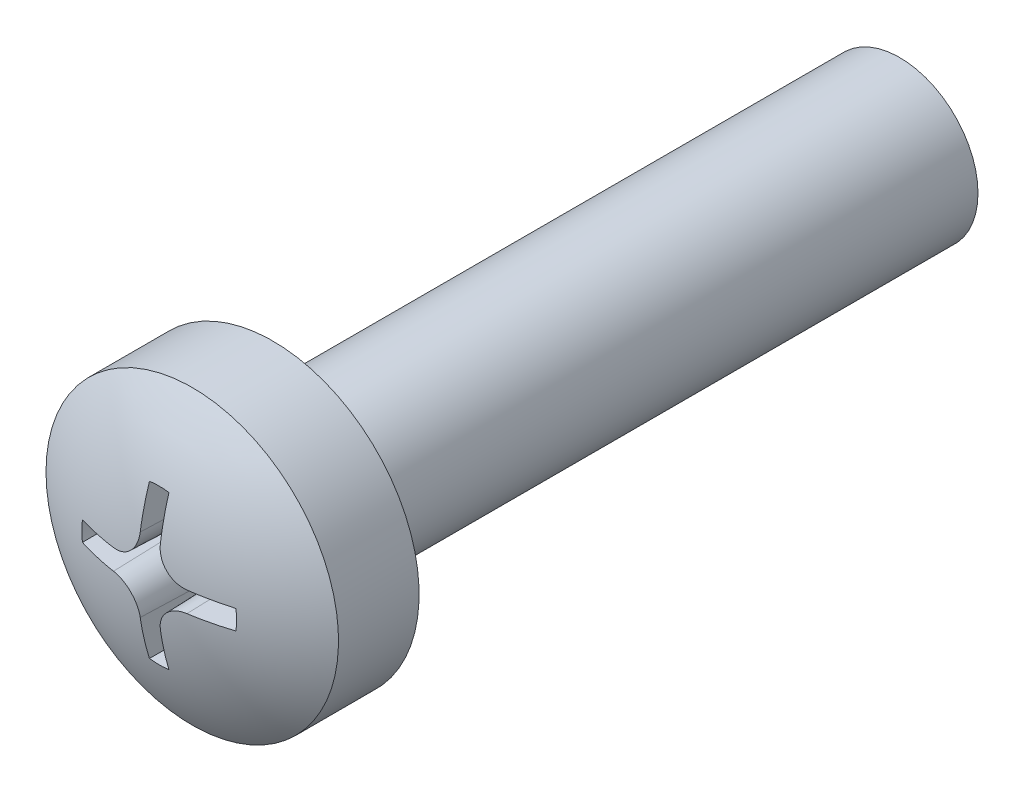
ISO-10303-21;
HEADER;
FILE_DESCRIPTION(('STEP AP214'),'2;1');
FILE_NAME('part.step','',(''),(''),'','','');
FILE_SCHEMA(('AUTOMOTIVE_DESIGN { 1 0 10303 214 1 1 1 1 }'));
ENDSEC;
DATA;
#1=APPLICATION_CONTEXT('core data for automotive mechanical design processes');
#2=APPLICATION_PROTOCOL_DEFINITION('international standard','automotive_design',2000,#1);
#3=PRODUCT_CONTEXT('',#1,'mechanical');
#4=PRODUCT('Part','Part','',(#3));
#5=PRODUCT_RELATED_PRODUCT_CATEGORY('part','',(#4));
#6=PRODUCT_DEFINITION_FORMATION('','',#4);
#7=PRODUCT_DEFINITION_CONTEXT('part definition',#1,'design');
#8=PRODUCT_DEFINITION('design','',#6,#7);
#9=PRODUCT_DEFINITION_SHAPE('','',#8);
#10=(LENGTH_UNIT() NAMED_UNIT(*) SI_UNIT(.MILLI.,.METRE.));
#11=(NAMED_UNIT(*) PLANE_ANGLE_UNIT() SI_UNIT($,.RADIAN.));
#12=(NAMED_UNIT(*) SI_UNIT($,.STERADIAN.) SOLID_ANGLE_UNIT());
#13=UNCERTAINTY_MEASURE_WITH_UNIT(LENGTH_MEASURE(1.E-05),#10,'distance_accuracy_value','');
#14=(GEOMETRIC_REPRESENTATION_CONTEXT(3) GLOBAL_UNCERTAINTY_ASSIGNED_CONTEXT((#13)) GLOBAL_UNIT_ASSIGNED_CONTEXT((#10,
#11,#12)) REPRESENTATION_CONTEXT('',''));
#15=CARTESIAN_POINT('',(0.,0.,0.));
#16=DIRECTION('',(0.,0.,1.));
#17=DIRECTION('',(1.,0.,0.));
#18=AXIS2_PLACEMENT_3D('',#15,#16,#17);
#19=CARTESIAN_POINT('',(0.,0.,12.));
#20=DIRECTION('',(0.,0.,-1.));
#21=DIRECTION('',(-1.,0.,0.));
#22=AXIS2_PLACEMENT_3D('',#19,#20,#21);
#23=CYLINDRICAL_SURFACE('',#22,1.5);
#24=CARTESIAN_POINT('',(0.,0.,12.));
#25=DIRECTION('',(0.,0.,1.));
#26=DIRECTION('',(1.,0.,0.));
#27=AXIS2_PLACEMENT_3D('',#24,#25,#26);
#28=CIRCLE('',#27,1.5);
#29=CARTESIAN_POINT('',(1.5,0.,12.));
#30=VERTEX_POINT('',#29);
#31=EDGE_CURVE('E213',#30,#30,#28,.T.);
#32=ORIENTED_EDGE('',*,*,#31,.F.);
#33=EDGE_LOOP('',(#32));
#34=FACE_BOUND('',#33,.T.);
#35=CARTESIAN_POINT('',(0.,0.,-0.0001));
#36=DIRECTION('',(0.,0.,1.));
#37=DIRECTION('',(1.,0.,0.));
#38=AXIS2_PLACEMENT_3D('',#35,#36,#37);
#39=CIRCLE('',#38,1.5);
#40=CARTESIAN_POINT('',(1.5,0.,-0.0001));
#41=VERTEX_POINT('',#40);
#42=EDGE_CURVE('E210',#41,#41,#39,.T.);
#43=ORIENTED_EDGE('',*,*,#42,.T.);
#44=EDGE_LOOP('',(#43));
#45=FACE_BOUND('',#44,.T.);
#46=ADVANCED_FACE('F39',(#34,#45),#23,.T.);
#47=CARTESIAN_POINT('',(0.,0.,-0.0001));
#48=DIRECTION('',(0.,0.,1.));
#49=DIRECTION('',(1.,0.,0.));
#50=AXIS2_PLACEMENT_3D('',#47,#48,#49);
#51=PLANE('',#50);
#52=ORIENTED_EDGE('',*,*,#42,.F.);
#53=EDGE_LOOP('',(#52));
#54=FACE_BOUND('',#53,.T.);
#55=ADVANCED_FACE('F300',(#54),#51,.F.);
#56=CARTESIAN_POINT('',(0.,0.,12.));
#57=DIRECTION('',(0.,0.,-1.));
#58=DIRECTION('',(-1.,0.,0.));
#59=AXIS2_PLACEMENT_3D('',#56,#57,#58);
#60=PLANE('',#59);
#61=ORIENTED_EDGE('',*,*,#31,.T.);
#62=EDGE_LOOP('',(#61));
#63=FACE_BOUND('',#62,.T.);
#64=CARTESIAN_POINT('',(0.,0.,12.));
#65=DIRECTION('',(0.,0.,-1.));
#66=DIRECTION('',(-1.,0.,0.));
#67=AXIS2_PLACEMENT_3D('',#64,#65,#66);
#68=CIRCLE('',#67,2.79999990016222);
#69=CARTESIAN_POINT('',(-2.79999990016222,0.,12.));
#70=VERTEX_POINT('',#69);
#71=EDGE_CURVE('E207',#70,#70,#68,.T.);
#72=ORIENTED_EDGE('',*,*,#71,.T.);
#73=EDGE_LOOP('',(#72));
#74=FACE_BOUND('',#73,.T.);
#75=ADVANCED_FACE('F305',(#63,#74),#60,.T.);
#76=CARTESIAN_POINT('',(0.,0.,-0.393620134621003));
#77=DIRECTION('',(0.,0.,-1.));
#78=DIRECTION('',(-1.,0.,0.));
#79=AXIS2_PLACEMENT_3D('',#76,#77,#78);
#80=CYLINDRICAL_SURFACE('',#79,2.79999990016222);
#81=CARTESIAN_POINT('',(0.,0.,13.5424630797893));
#82=DIRECTION('',(0.,0.,-1.));
#83=DIRECTION('',(-1.,0.,0.));
#84=AXIS2_PLACEMENT_3D('',#81,#82,#83);
#85=CIRCLE('',#84,2.79999990016222);
#86=CARTESIAN_POINT('',(-2.79999990016222,0.,13.5424630797893));
#87=VERTEX_POINT('',#86);
#88=EDGE_CURVE('E155',#87,#87,#85,.T.);
#89=ORIENTED_EDGE('',*,*,#88,.T.);
#90=EDGE_LOOP('',(#89));
#91=FACE_BOUND('',#90,.T.);
#92=ORIENTED_EDGE('',*,*,#71,.F.);
#93=EDGE_LOOP('',(#92));
#94=FACE_BOUND('',#93,.T.);
#95=ADVANCED_FACE('F313',(#91,#94),#80,.T.);
#96=CARTESIAN_POINT('',(0.,0.,9.40000011175871));
#97=DIRECTION('',(0.,0.,-1.));
#98=DIRECTION('',(1.,0.,0.));
#99=AXIS2_PLACEMENT_3D('',#96,#97,#98);
#100=SPHERICAL_SURFACE('',#99,4.99999988824129);
#101=CARTESIAN_POINT('',(0.,0.,14.1754183821502));
#102=DIRECTION('',(0.,0.,-1.));
#103=DIRECTION('',(-1.,0.,0.));
#104=AXIS2_PLACEMENT_3D('',#101,#102,#103);
#105=CIRCLE('',#104,1.4816812157899);
#106=CARTESIAN_POINT('',(0.18668120666759,1.46987392394782,14.1754183821501));
#107=VERTEX_POINT('',#106);
#108=CARTESIAN_POINT('',(-0.186681206667593,1.46987392394782,14.1754183821501));
#109=VERTEX_POINT('',#108);
#110=EDGE_CURVE('E11',#107,#109,#105,.F.);
#111=ORIENTED_EDGE('',*,*,#110,.F.);
#112=CARTESIAN_POINT('',(0.0198956640512633,0.,9.39930533986049));
#113=DIRECTION('',(0.999390827019096,0.,-0.034899496702501));
#114=DIRECTION('',(-0.034899496702501,0.,-0.999390827019096));
#115=AXIS2_PLACEMENT_3D('',#112,#113,#114);
#116=CIRCLE('',#115,4.99996025606773);
#117=CARTESIAN_POINT('',(0.192632610704328,0.708178557647151,14.3458442955351));
#118=VERTEX_POINT('',#117);
#119=EDGE_CURVE('E46',#107,#118,#116,.T.);
#120=ORIENTED_EDGE('',*,*,#119,.T.);
#121=CARTESIAN_POINT('',(0.192631650862954,0.708378557647151,14.345815691475));
#122=CARTESIAN_POINT('',(0.192737639690806,0.679822741796073,14.3499041439734));
#123=CARTESIAN_POINT('',(0.195268867839181,0.651227392830896,14.3536463362414));
#124=CARTESIAN_POINT('',(0.205046889209158,0.59476703827459,14.3603460551712));
#125=CARTESIAN_POINT('',(0.212292618678018,0.566901869404939,14.3633037586285));
#126=CARTESIAN_POINT('',(0.231373694375068,0.51267267841366,14.3683466063254));
#127=CARTESIAN_POINT('',(0.24321326807329,0.486310064716558,14.3704309431667));
#128=CARTESIAN_POINT('',(0.271156607880554,0.435900324544809,14.3736603491012));
#129=CARTESIAN_POINT('',(0.287258672100205,0.411852279143786,14.3748057923215));
#130=CARTESIAN_POINT('',(0.323072075489885,0.367028886470806,14.3761158025717));
#131=CARTESIAN_POINT('',(0.342740648168188,0.346219679514825,14.3762912893596));
#132=CARTESIAN_POINT('',(0.385246757538768,0.30814670944778,14.3756853456951));
#133=CARTESIAN_POINT('',(0.408084792807392,0.290883505206881,14.3749037645383));
#134=CARTESIAN_POINT('',(0.456147210008961,0.260464262414973,14.3724133951705));
#135=CARTESIAN_POINT('',(0.481359759209805,0.247289131136679,14.3707090224733));
#136=CARTESIAN_POINT('',(0.533541444049374,0.225283958921734,14.3664258870809));
#137=CARTESIAN_POINT('',(0.560509920861877,0.216452298826715,14.3638474508254));
#138=CARTESIAN_POINT('',(0.606876295057338,0.205379627868596,14.3588207651558));
#139=CARTESIAN_POINT('',(0.626020977094074,0.201943221890059,14.3565812960749));
#140=CARTESIAN_POINT('',(0.66450204404321,0.197253494550336,14.3517582366185));
#141=CARTESIAN_POINT('',(0.683838077649067,0.195996727127303,14.349175196413));
#142=CARTESIAN_POINT('',(0.703167546290468,0.195835015722445,14.3464334662955));
#143=B_SPLINE_CURVE_WITH_KNOTS('',3,(#121,#122,#123,#124,#125,#126,#127,#128,#129,#130,#131,
#132,#133,#134,#135,#136,#137,#138,#139,#140,#141,#142),.UNSPECIFIED.,.F.,.F.,(4,2,2,2,2,2,2,2,
2,2,4),(0.,0.0864417829586744,0.172864068455127,0.259366073122684,0.345833591994609,
0.431325646912079,0.516831165542016,0.601931114274005,0.686999315371811,0.745618262708562,
0.804144447281415),.UNSPECIFIED.);
#144=CARTESIAN_POINT('',(0.702917362553185,0.19583721033533,14.3464689381926));
#145=VERTEX_POINT('',#144);
#146=EDGE_CURVE('E282',#118,#145,#143,.T.);
#147=ORIENTED_EDGE('',*,*,#146,.T.);
#148=CARTESIAN_POINT('',(0.000105390153350327,0.0259265633149154,9.39909472873738));
#149=DIRECTION('',(0.00406243901494415,0.999382570249833,-0.034899496702501));
#150=DIRECTION('',(0.,0.0348997846864301,0.999390816962434));
#151=AXIS2_PLACEMENT_3D('',#148,#149,#150);
#152=CIRCLE('',#151,4.99993258603575);
#153=CARTESIAN_POINT('',(1.46986565043204,0.186746338396853,14.1754183821502));
#154=VERTEX_POINT('',#153);
#155=EDGE_CURVE('E280',#154,#145,#152,.F.);
#156=ORIENTED_EDGE('',*,*,#155,.F.);
#157=CARTESIAN_POINT('',(0.,0.,14.1754183821502));
#158=DIRECTION('',(0.,0.,-1.));
#159=DIRECTION('',(-1.,0.,0.));
#160=AXIS2_PLACEMENT_3D('',#157,#158,#159);
#161=CIRCLE('',#160,1.4816812157899);
#162=CARTESIAN_POINT('',(1.46986565043204,-0.186746338396852,14.1754183821501));
#163=VERTEX_POINT('',#162);
#164=EDGE_CURVE('E278',#163,#154,#161,.F.);
#165=ORIENTED_EDGE('',*,*,#164,.F.);
#166=CARTESIAN_POINT('',(0.000105390153350358,-0.0259265633149169,9.39909472873738));
#167=DIRECTION('',(0.00406243901494512,-0.999382570249833,-0.034899496702501));
#168=DIRECTION('',(0.,0.0348997846864301,-0.999390816962434));
#169=AXIS2_PLACEMENT_3D('',#166,#167,#168);
#170=CIRCLE('',#169,4.99993258603575);
#171=CARTESIAN_POINT('',(0.702917362553185,-0.195837210335331,14.3464689381926));
#172=VERTEX_POINT('',#171);
#173=EDGE_CURVE('E275',#163,#172,#170,.T.);
#174=ORIENTED_EDGE('',*,*,#173,.T.);
#175=CARTESIAN_POINT('',(0.192631650862954,-0.708378557647152,14.345815691475));
#176=CARTESIAN_POINT('',(0.192737639690806,-0.679822741796074,14.3499041439734));
#177=CARTESIAN_POINT('',(0.195268867839181,-0.651227392830896,14.3536463362414));
#178=CARTESIAN_POINT('',(0.205046889209158,-0.59476703827459,14.3603460551712));
#179=CARTESIAN_POINT('',(0.212292618678018,-0.56690186940494,14.3633037586285));
#180=CARTESIAN_POINT('',(0.231373694375068,-0.512672678413661,14.3683466063254));
#181=CARTESIAN_POINT('',(0.24321326807329,-0.486310064716559,14.3704309431667));
#182=CARTESIAN_POINT('',(0.271156607880554,-0.435900324544809,14.3736603491012));
#183=CARTESIAN_POINT('',(0.287258672100205,-0.411852279143786,14.3748057923215));
#184=CARTESIAN_POINT('',(0.323072075489885,-0.367028886470807,14.3761158025717));
#185=CARTESIAN_POINT('',(0.342740648168188,-0.346219679514826,14.3762912893596));
#186=CARTESIAN_POINT('',(0.385246757538768,-0.308146709447781,14.3756853456951));
#187=CARTESIAN_POINT('',(0.408084792807392,-0.290883505206882,14.3749037645383));
#188=CARTESIAN_POINT('',(0.456147210008961,-0.260464262414974,14.3724133951705));
#189=CARTESIAN_POINT('',(0.481359759209805,-0.247289131136679,14.3707090224733));
#190=CARTESIAN_POINT('',(0.533541444049374,-0.225283958921735,14.3664258870809));
#191=CARTESIAN_POINT('',(0.560509920861878,-0.216452298826716,14.3638474508254));
#192=CARTESIAN_POINT('',(0.606876295057338,-0.205379627868597,14.3588207651558));
#193=CARTESIAN_POINT('',(0.626020977094074,-0.201943221890059,14.3565812960749));
#194=CARTESIAN_POINT('',(0.66450204404321,-0.197253494550336,14.3517582366185));
#195=CARTESIAN_POINT('',(0.683838077649067,-0.195996727127304,14.349175196413));
#196=CARTESIAN_POINT('',(0.703167546290467,-0.195835015722445,14.3464334662955));
#197=B_SPLINE_CURVE_WITH_KNOTS('',3,(#175,#176,#177,#178,#179,#180,#181,#182,#183,#184,#185,
#186,#187,#188,#189,#190,#191,#192,#193,#194,#195,#196),.UNSPECIFIED.,.F.,.F.,(4,2,2,2,2,2,2,2,
2,2,4),(0.,0.0864417829586746,0.172864068455127,0.259366073122684,0.345833591994609,
0.431325646912079,0.516831165542017,0.601931114274005,0.686999315371811,0.745618262708562,
0.804144447281414),.UNSPECIFIED.);
#198=CARTESIAN_POINT('',(0.192632610704328,-0.708178557647152,14.3458442955351));
#199=VERTEX_POINT('',#198);
#200=EDGE_CURVE('E269',#199,#172,#197,.T.);
#201=ORIENTED_EDGE('',*,*,#200,.F.);
#202=CARTESIAN_POINT('',(0.0198956640512633,0.,9.39930533986049));
#203=DIRECTION('',(0.999390827019096,0.,-0.034899496702501));
#204=DIRECTION('',(-0.034899496702501,0.,-0.999390827019096));
#205=AXIS2_PLACEMENT_3D('',#202,#203,#204);
#206=CIRCLE('',#205,4.99996025606773);
#207=CARTESIAN_POINT('',(0.186681206667591,-1.46987392394782,14.1754183821502));
#208=VERTEX_POINT('',#207);
#209=EDGE_CURVE('E267',#208,#199,#206,.F.);
#210=ORIENTED_EDGE('',*,*,#209,.F.);
#211=CARTESIAN_POINT('',(0.,0.,14.1754183821502));
#212=DIRECTION('',(0.,0.,-1.));
#213=DIRECTION('',(-1.,0.,0.));
#214=AXIS2_PLACEMENT_3D('',#211,#212,#213);
#215=CIRCLE('',#214,1.4816812157899);
#216=CARTESIAN_POINT('',(-0.186681206667593,-1.46987392394782,14.1754183821501));
#217=VERTEX_POINT('',#216);
#218=EDGE_CURVE('E264',#208,#217,#215,.T.);
#219=ORIENTED_EDGE('',*,*,#218,.T.);
#220=CARTESIAN_POINT('',(-0.0198956640512654,0.,9.39930533986049));
#221=DIRECTION('',(-0.999390827019096,0.,-0.034899496702501));
#222=DIRECTION('',(-0.034899496702501,0.,0.999390827019096));
#223=AXIS2_PLACEMENT_3D('',#220,#221,#222);
#224=CIRCLE('',#223,4.99996025606773);
#225=CARTESIAN_POINT('',(-0.19263261070433,-0.708178557647151,14.3458442955351));
#226=VERTEX_POINT('',#225);
#227=EDGE_CURVE('E260',#217,#226,#224,.T.);
#228=ORIENTED_EDGE('',*,*,#227,.T.);
#229=CARTESIAN_POINT('',(-0.703167546290469,-0.195835015722445,14.3464334662955));
#230=CARTESIAN_POINT('',(-0.674619447950853,-0.196052963217916,14.3504857241648));
#231=CARTESIAN_POINT('',(-0.646041434637229,-0.198695168407334,14.3541890416191));
#232=CARTESIAN_POINT('',(-0.589634494727846,-0.208689654905481,14.3608068014756));
#233=CARTESIAN_POINT('',(-0.561805393198952,-0.216040826152063,14.3637214295682));
#234=CARTESIAN_POINT('',(-0.50766612082123,-0.235323893103952,14.3686750861046));
#235=CARTESIAN_POINT('',(-0.481357369172764,-0.247259991703852,14.370713307523));
#236=CARTESIAN_POINT('',(-0.431071022991568,-0.275383990623327,14.3738489099634));
#237=CARTESIAN_POINT('',(-0.407092510169895,-0.291570206692359,14.3749466629444));
#238=CARTESIAN_POINT('',(-0.362416703115866,-0.327538701485095,14.3761618083202));
#239=CARTESIAN_POINT('',(-0.34168588735275,-0.34727899131776,14.376289966384));
#240=CARTESIAN_POINT('',(-0.303780328011577,-0.389912448398922,14.375590364716));
#241=CARTESIAN_POINT('',(-0.286606147147996,-0.412806113607388,14.3747624538554));
#242=CARTESIAN_POINT('',(-0.25636685808405,-0.46096947591693,14.3721816258056));
#243=CARTESIAN_POINT('',(-0.243283863198686,-0.486228184526672,14.3704328274806));
#244=CARTESIAN_POINT('',(-0.22146899790456,-0.538485231439468,14.366063898297));
#245=CARTESIAN_POINT('',(-0.212735526227358,-0.565482925398505,14.3634440886927));
#246=CARTESIAN_POINT('',(-0.201823996880683,-0.61191361527353,14.3583478129874));
#247=CARTESIAN_POINT('',(-0.198453223120025,-0.631098599357625,14.3560784464194));
#248=CARTESIAN_POINT('',(-0.193901764340931,-0.669652448873598,14.3511968730386));
#249=CARTESIAN_POINT('',(-0.192717622166764,-0.689020975292663,14.3485852144187));
#250=CARTESIAN_POINT('',(-0.192631650862956,-0.708378557647151,14.345815691475));
#251=B_SPLINE_CURVE_WITH_KNOTS('',3,(#229,#230,#231,#232,#233,#234,#235,#236,#237,#238,#239,
#240,#241,#242,#243,#244,#245,#246,#247,#248,#249,#250),.UNSPECIFIED.,.F.,.F.,(4,2,2,2,2,2,2,2,
2,2,4),(0.,0.0864053436114192,0.17279032606061,0.259254685287909,0.345684831711331,
0.431153892876567,0.51663646625136,0.601739908197797,0.686811996276178,0.745524819849982,
0.804144736260156),.UNSPECIFIED.);
#252=CARTESIAN_POINT('',(-0.702917362553187,-0.195837210335331,14.3464689381926));
#253=VERTEX_POINT('',#252);
#254=EDGE_CURVE('E253',#253,#226,#251,.T.);
#255=ORIENTED_EDGE('',*,*,#254,.F.);
#256=CARTESIAN_POINT('',(-0.000105390153349678,-0.0259265633149168,9.39909472873738));
#257=DIRECTION('',(-0.0040624390149453,-0.999382570249833,-0.034899496702501));
#258=DIRECTION('',(0.,0.0348997846864301,-0.999390816962434));
#259=AXIS2_PLACEMENT_3D('',#256,#257,#258);
#260=CIRCLE('',#259,4.99993258603575);
#261=CARTESIAN_POINT('',(-1.46986565043204,-0.186746338396853,14.1754183821502));
#262=VERTEX_POINT('',#261);
#263=EDGE_CURVE('E261',#262,#253,#260,.F.);
#264=ORIENTED_EDGE('',*,*,#263,.F.);
#265=CARTESIAN_POINT('',(0.,0.,14.1754183821502));
#266=DIRECTION('',(0.,0.,-1.));
#267=DIRECTION('',(-1.,0.,0.));
#268=AXIS2_PLACEMENT_3D('',#265,#266,#267);
#269=CIRCLE('',#268,1.4816812157899);
#270=CARTESIAN_POINT('',(-1.46986565043204,0.186746338396852,14.1754183821501));
#271=VERTEX_POINT('',#270);
#272=EDGE_CURVE('E521',#262,#271,#269,.T.);
#273=ORIENTED_EDGE('',*,*,#272,.T.);
#274=CARTESIAN_POINT('',(-0.000105390153349678,0.0259265633149168,9.39909472873738));
#275=DIRECTION('',(-0.00406243901494529,0.999382570249833,-0.034899496702501));
#276=DIRECTION('',(0.,0.0348997846864301,0.999390816962434));
#277=AXIS2_PLACEMENT_3D('',#274,#275,#276);
#278=CIRCLE('',#277,4.99993258603575);
#279=CARTESIAN_POINT('',(-0.702917362553187,0.195837210335331,14.3464689381926));
#280=VERTEX_POINT('',#279);
#281=EDGE_CURVE('E226',#271,#280,#278,.T.);
#282=ORIENTED_EDGE('',*,*,#281,.T.);
#283=CARTESIAN_POINT('',(-0.192631650862955,0.708378557647151,14.345815691475));
#284=CARTESIAN_POINT('',(-0.192737639690808,0.679822741796074,14.3499041439734));
#285=CARTESIAN_POINT('',(-0.195268867839183,0.651227392830896,14.3536463362414));
#286=CARTESIAN_POINT('',(-0.20504688920916,0.59476703827459,14.3603460551712));
#287=CARTESIAN_POINT('',(-0.21229261867802,0.566901869404939,14.3633037586285));
#288=CARTESIAN_POINT('',(-0.231373694375069,0.51267267841366,14.3683466063254));
#289=CARTESIAN_POINT('',(-0.243213268073292,0.486310064716559,14.3704309431667));
#290=CARTESIAN_POINT('',(-0.271156607880555,0.435900324544809,14.3736603491012));
#291=CARTESIAN_POINT('',(-0.287258672100206,0.411852279143786,14.3748057923215));
#292=CARTESIAN_POINT('',(-0.323072075489887,0.367028886470806,14.3761158025717));
#293=CARTESIAN_POINT('',(-0.34274064816819,0.346219679514826,14.3762912893596));
#294=CARTESIAN_POINT('',(-0.38524675753877,0.30814670944778,14.3756853456951));
#295=CARTESIAN_POINT('',(-0.408084792807394,0.290883505206882,14.3749037645383));
#296=CARTESIAN_POINT('',(-0.456147210008963,0.260464262414974,14.3724133951705));
#297=CARTESIAN_POINT('',(-0.481359759209807,0.247289131136679,14.3707090224733));
#298=CARTESIAN_POINT('',(-0.533541444049376,0.225283958921735,14.3664258870809));
#299=CARTESIAN_POINT('',(-0.560509920861879,0.216452298826716,14.3638474508254));
#300=CARTESIAN_POINT('',(-0.60687629505734,0.205379627868597,14.3588207651558));
#301=CARTESIAN_POINT('',(-0.626020977094076,0.201943221890059,14.3565812960749));
#302=CARTESIAN_POINT('',(-0.664502044043212,0.197253494550336,14.3517582366185));
#303=CARTESIAN_POINT('',(-0.683838077649068,0.195996727127304,14.349175196413));
#304=CARTESIAN_POINT('',(-0.703167546290469,0.195835015722445,14.3464334662955));
#305=B_SPLINE_CURVE_WITH_KNOTS('',3,(#283,#284,#285,#286,#287,#288,#289,#290,#291,#292,#293,
#294,#295,#296,#297,#298,#299,#300,#301,#302,#303,#304),.UNSPECIFIED.,.F.,.F.,(4,2,2,2,2,2,2,2,
2,2,4),(0.,0.0864417829586746,0.172864068455127,0.259366073122684,0.345833591994609,
0.431325646912079,0.516831165542016,0.601931114274004,0.68699931537181,0.745618262708561,
0.804144447281414),.UNSPECIFIED.);
#306=CARTESIAN_POINT('',(-0.19263261070433,0.708178557647151,14.3458442955351));
#307=VERTEX_POINT('',#306);
#308=EDGE_CURVE('E218',#307,#280,#305,.T.);
#309=ORIENTED_EDGE('',*,*,#308,.F.);
#310=CARTESIAN_POINT('',(-0.0198956640512644,0.,9.39930533986049));
#311=DIRECTION('',(-0.999390827019096,0.,-0.034899496702501));
#312=DIRECTION('',(-0.034899496702501,0.,0.999390827019096));
#313=AXIS2_PLACEMENT_3D('',#310,#311,#312);
#314=CIRCLE('',#313,4.99996025606773);
#315=EDGE_CURVE('E216',#109,#307,#314,.F.);
#316=ORIENTED_EDGE('',*,*,#315,.F.);
#317=EDGE_LOOP('',(#111,#120,#147,#156,#165,#174,#201,#210,#219,#228,#255,#264,#273,#282,#309,#316));
#318=FACE_BOUND('',#317,.T.);
#319=ORIENTED_EDGE('',*,*,#88,.F.);
#320=EDGE_LOOP('',(#319));
#321=FACE_BOUND('',#320,.T.);
#322=ADVANCED_FACE('F228',(#318,#321),#100,.T.);
#323=CARTESIAN_POINT('',(0.,0.,14.7000001));
#324=DIRECTION('',(0.,0.,1.));
#325=DIRECTION('',(1.,0.,0.));
#326=AXIS2_PLACEMENT_3D('',#323,#324,#325);
#327=CONICAL_SURFACE('',#326,1.50000001303852,0.0349065850398867);
#328=ORIENTED_EDGE('',*,*,#110,.T.);
#329=CARTESIAN_POINT('',(-0.142142619910814,1.43009594495933,12.9000001309199));
#330=CARTESIAN_POINT('',(-0.152618658076336,1.43957885994155,13.1999946132293));
#331=CARTESIAN_POINT('',(-0.163094792502732,1.4489727928664,13.4999918520894));
#332=CARTESIAN_POINT('',(-0.184047253837866,1.46758269456637,14.0999918417828));
#333=CARTESIAN_POINT('',(-0.194523580746602,1.47679866334215,14.399994592616));
#334=CARTESIAN_POINT('',(-0.205000003916213,1.48592565006124,14.7000001));
#335=B_SPLINE_CURVE_WITH_KNOTS('',3,(#329,#330,#331,#332,#333,#334),.UNSPECIFIED.,.F.,.F.,(4,2,
4),(0.,0.900981158642231,1.80196231389533),.UNSPECIFIED.);
#336=CARTESIAN_POINT('',(-0.142142619910814,1.43009594495933,12.9000001309199));
#337=VERTEX_POINT('',#336);
#338=EDGE_CURVE('E53',#337,#109,#335,.T.);
#339=ORIENTED_EDGE('',*,*,#338,.F.);
#340=CARTESIAN_POINT('',(0.,0.,12.9000001309199));
#341=DIRECTION('',(0.,0.,1.));
#342=DIRECTION('',(1.,0.,0.));
#343=AXIS2_PLACEMENT_3D('',#340,#341,#342);
#344=CIRCLE('',#343,1.43714262903312);
#345=CARTESIAN_POINT('',(0.142142619910811,1.43009594495933,12.9000001309199));
#346=VERTEX_POINT('',#345);
#347=EDGE_CURVE('E163',#346,#337,#344,.T.);
#348=ORIENTED_EDGE('',*,*,#347,.F.);
#349=CARTESIAN_POINT('',(0.142142619910811,1.43009594495933,12.9000001309199));
#350=CARTESIAN_POINT('',(0.152618658076333,1.43957885994155,13.1999946132293));
#351=CARTESIAN_POINT('',(0.16309479250273,1.4489727928664,13.4999918520894));
#352=CARTESIAN_POINT('',(0.184047253837863,1.46758269456637,14.0999918417828));
#353=CARTESIAN_POINT('',(0.1945235807466,1.47679866334215,14.399994592616));
#354=CARTESIAN_POINT('',(0.205000003916211,1.48592565006124,14.7000001));
#355=B_SPLINE_CURVE_WITH_KNOTS('',3,(#349,#350,#351,#352,#353,#354),.UNSPECIFIED.,.F.,.F.,(4,2,
4),(0.,0.900981158642231,1.80196231389533),.UNSPECIFIED.);
#356=EDGE_CURVE('E147',#346,#107,#355,.T.);
#357=ORIENTED_EDGE('',*,*,#356,.T.);
#358=EDGE_LOOP('',(#328,#339,#348,#357));
#359=FACE_BOUND('',#358,.T.);
#360=ADVANCED_FACE('F167',(#359),#327,.F.);
#361=CARTESIAN_POINT('',(0.205000003916211,1.48592565006124,14.7000001));
#362=DIRECTION('',(0.999390827019096,0.,-0.034899496702501));
#363=DIRECTION('',(-0.034899496702501,0.,-0.999390827019096));
#364=AXIS2_PLACEMENT_3D('',#361,#362,#363);
#365=PLANE('',#364);
#366=ORIENTED_EDGE('',*,*,#356,.F.);
#367=DIRECTION('',(0.,1.,0.));
#368=VECTOR('',#367,1.);
#369=CARTESIAN_POINT('',(0.142142619910812,0.,12.9000001309199));
#370=LINE('',#369,#368);
#371=CARTESIAN_POINT('',(0.142142619910811,0.708178557647151,12.9000001309199));
#372=VERTEX_POINT('',#371);
#373=EDGE_CURVE('E150',#346,#372,#370,.F.);
#374=ORIENTED_EDGE('',*,*,#373,.T.);
#375=DIRECTION('',(0.034899496702501,0.,0.999390827019096));
#376=VECTOR('',#375,1.);
#377=CARTESIAN_POINT('',(0.20500000391621,0.708178557647151,14.7000001));
#378=LINE('',#377,#376);
#379=EDGE_CURVE('E156',#372,#118,#378,.T.);
#380=ORIENTED_EDGE('',*,*,#379,.T.);
#381=ORIENTED_EDGE('',*,*,#119,.F.);
#382=EDGE_LOOP('',(#366,#374,#380,#381));
#383=FACE_BOUND('',#382,.T.);
#384=ADVANCED_FACE('F149',(#383),#365,.F.);
#385=CARTESIAN_POINT('',(0.705000003916211,0.708178557647151,14.7000001));
#386=DIRECTION('',(0.,0.,-1.));
#387=DIRECTION('',(1.,0.,0.));
#388=AXIS2_PLACEMENT_3D('',#385,#386,#387);
#389=CONICAL_SURFACE('',#388,0.5,0.0349065850398867);
#390=ORIENTED_EDGE('',*,*,#379,.F.);
#391=CARTESIAN_POINT('',(0.705000003916211,0.708178557647151,12.9000001309199));
#392=DIRECTION('',(0.,0.,1.));
#393=DIRECTION('',(1.,0.,0.));
#394=AXIS2_PLACEMENT_3D('',#391,#392,#393);
#395=CIRCLE('',#394,0.562857384005399);
#396=CARTESIAN_POINT('',(0.702712036351556,0.145325823858085,12.9000001309199));
#397=VERTEX_POINT('',#396);
#398=EDGE_CURVE('E165',#372,#397,#395,.T.);
#399=ORIENTED_EDGE('',*,*,#398,.T.);
#400=DIRECTION('',(0.000141863496415148,0.0348992083697649,0.999390827019096));
#401=VECTOR('',#400,1.);
#402=CARTESIAN_POINT('',(0.702967546290468,0.208182688548215,14.7000001));
#403=LINE('',#402,#401);
#404=EDGE_CURVE('E423',#397,#145,#403,.T.);
#405=ORIENTED_EDGE('',*,*,#404,.T.);
#406=ORIENTED_EDGE('',*,*,#146,.F.);
#407=EDGE_LOOP('',(#390,#399,#405,#406));
#408=FACE_BOUND('',#407,.T.);
#409=ADVANCED_FACE('F288',(#408),#389,.T.);
#410=CARTESIAN_POINT('',(1.48592565006123,0.205000003916213,14.7000001));
#411=DIRECTION('',(0.00406243901494415,0.999382570249833,-0.034899496702501));
#412=DIRECTION('',(0.,0.0348997846864301,0.999390816962434));
#413=AXIS2_PLACEMENT_3D('',#410,#411,#412);
#414=PLANE('',#413);
#415=ORIENTED_EDGE('',*,*,#155,.T.);
#416=ORIENTED_EDGE('',*,*,#404,.F.);
#417=DIRECTION('',(-0.99999173819787,0.00406491525148502,0.));
#418=VECTOR('',#417,1.);
#419=CARTESIAN_POINT('',(0.000602343564913371,0.148179863836023,12.9000001309199));
#420=LINE('',#419,#418);
#421=CARTESIAN_POINT('',(1.43007341244828,0.142369137079488,12.9000001309199));
#422=VERTEX_POINT('',#421);
#423=EDGE_CURVE('E176',#422,#397,#420,.T.);
#424=ORIENTED_EDGE('',*,*,#423,.F.);
#425=CARTESIAN_POINT('',(1.43007341244828,0.142369137079488,12.9000001309199));
#426=CARTESIAN_POINT('',(1.43955869120937,0.152806706922151,13.1999946790441));
#427=CARTESIAN_POINT('',(1.44895568373278,0.163244730756208,13.4999919508073));
#428=CARTESIAN_POINT('',(1.46757309626977,0.184121686368453,14.0999919405007));
#429=CARTESIAN_POINT('',(1.47679351628402,0.194560618146638,14.3999946584309));
#430=CARTESIAN_POINT('',(1.48592565006123,0.205000003916213,14.7000001));
#431=B_SPLINE_CURVE_WITH_KNOTS('',3,(#425,#426,#427,#428,#429,#430),.UNSPECIFIED.,.F.,.F.,(4,2,
4),(0.,0.900977563471273,1.80195512360615),.UNSPECIFIED.);
#432=EDGE_CURVE('E417',#422,#154,#431,.T.);
#433=ORIENTED_EDGE('',*,*,#432,.T.);
#434=EDGE_LOOP('',(#415,#416,#424,#433));
#435=FACE_BOUND('',#434,.T.);
#436=ADVANCED_FACE('F240',(#435),#414,.F.);
#437=CARTESIAN_POINT('',(0.,0.,14.7000001));
#438=DIRECTION('',(0.,0.,1.));
#439=DIRECTION('',(1.,0.,0.));
#440=AXIS2_PLACEMENT_3D('',#437,#438,#439);
#441=CONICAL_SURFACE('',#440,1.50000001303852,0.0349065850398867);
#442=ORIENTED_EDGE('',*,*,#164,.T.);
#443=ORIENTED_EDGE('',*,*,#432,.F.);
#444=CARTESIAN_POINT('',(0.,0.,12.9000001309199));
#445=DIRECTION('',(0.,0.,1.));
#446=DIRECTION('',(1.,0.,0.));
#447=AXIS2_PLACEMENT_3D('',#444,#445,#446);
#448=CIRCLE('',#447,1.43714262903312);
#449=CARTESIAN_POINT('',(1.43007341244828,-0.142369137079488,12.9000001309199));
#450=VERTEX_POINT('',#449);
#451=EDGE_CURVE('E178',#450,#422,#448,.T.);
#452=ORIENTED_EDGE('',*,*,#451,.F.);
#453=CARTESIAN_POINT('',(1.43007341244828,-0.142369137079488,12.9000001309199));
#454=CARTESIAN_POINT('',(1.43955869120937,-0.152806706922151,13.1999946790441));
#455=CARTESIAN_POINT('',(1.44895568373278,-0.163244730756208,13.4999919508073));
#456=CARTESIAN_POINT('',(1.46757309626977,-0.184121686368453,14.0999919405007));
#457=CARTESIAN_POINT('',(1.47679351628402,-0.194560618146638,14.3999946584309));
#458=CARTESIAN_POINT('',(1.48592565006123,-0.205000003916213,14.7000001));
#459=B_SPLINE_CURVE_WITH_KNOTS('',3,(#453,#454,#455,#456,#457,#458),.UNSPECIFIED.,.F.,.F.,(4,2,
4),(0.,0.900977563471273,1.80195512360615),.UNSPECIFIED.);
#460=EDGE_CURVE('E411',#450,#163,#459,.T.);
#461=ORIENTED_EDGE('',*,*,#460,.T.);
#462=EDGE_LOOP('',(#442,#443,#452,#461));
#463=FACE_BOUND('',#462,.T.);
#464=ADVANCED_FACE('F296',(#463),#441,.F.);
#465=CARTESIAN_POINT('',(1.48592565006123,-0.205000003916213,14.7000001));
#466=DIRECTION('',(0.00406243901494512,-0.999382570249833,-0.034899496702501));
#467=DIRECTION('',(0.,0.0348997846864301,-0.999390816962434));
#468=AXIS2_PLACEMENT_3D('',#465,#466,#467);
#469=PLANE('',#468);
#470=ORIENTED_EDGE('',*,*,#460,.F.);
#471=DIRECTION('',(0.99999173819787,0.00406491525148599,0.));
#472=VECTOR('',#471,1.);
#473=CARTESIAN_POINT('',(0.00060234356491352,-0.148179863836024,12.9000001309199));
#474=LINE('',#473,#472);
#475=CARTESIAN_POINT('',(0.702712036351556,-0.145325823858086,12.9000001309199));
#476=VERTEX_POINT('',#475);
#477=EDGE_CURVE('E181',#450,#476,#474,.F.);
#478=ORIENTED_EDGE('',*,*,#477,.T.);
#479=DIRECTION('',(0.000141863496415188,-0.0348992083697649,0.999390827019096));
#480=VECTOR('',#479,1.);
#481=CARTESIAN_POINT('',(0.702967546290468,-0.208182688548216,14.7000001));
#482=LINE('',#481,#480);
#483=EDGE_CURVE('E433',#476,#172,#482,.T.);
#484=ORIENTED_EDGE('',*,*,#483,.T.);
#485=ORIENTED_EDGE('',*,*,#173,.F.);
#486=EDGE_LOOP('',(#470,#478,#484,#485));
#487=FACE_BOUND('',#486,.T.);
#488=ADVANCED_FACE('F406',(#487),#469,.F.);
#489=CARTESIAN_POINT('',(0.705000003916211,-0.708178557647152,14.7000001));
#490=DIRECTION('',(0.,0.,-1.));
#491=DIRECTION('',(-1.,0.,0.));
#492=AXIS2_PLACEMENT_3D('',#489,#490,#491);
#493=CONICAL_SURFACE('',#492,0.5,0.0349065850398867);
#494=ORIENTED_EDGE('',*,*,#200,.T.);
#495=ORIENTED_EDGE('',*,*,#483,.F.);
#496=CARTESIAN_POINT('',(0.705000003916211,-0.708178557647152,12.9000001309199));
#497=DIRECTION('',(0.,0.,1.));
#498=DIRECTION('',(1.,0.,0.));
#499=AXIS2_PLACEMENT_3D('',#496,#497,#498);
#500=CIRCLE('',#499,0.562857384005399);
#501=CARTESIAN_POINT('',(0.142142619910812,-0.708178557647152,12.9000001309199));
#502=VERTEX_POINT('',#501);
#503=EDGE_CURVE('E183',#502,#476,#500,.F.);
#504=ORIENTED_EDGE('',*,*,#503,.F.);
#505=DIRECTION('',(0.034899496702501,0.,0.999390827019096));
#506=VECTOR('',#505,1.);
#507=CARTESIAN_POINT('',(0.205000003916211,-0.708178557647152,14.7000001));
#508=LINE('',#507,#506);
#509=EDGE_CURVE('E397',#502,#199,#508,.T.);
#510=ORIENTED_EDGE('',*,*,#509,.T.);
#511=EDGE_LOOP('',(#494,#495,#504,#510));
#512=FACE_BOUND('',#511,.T.);
#513=ADVANCED_FACE('F250',(#512),#493,.T.);
#514=CARTESIAN_POINT('',(0.205000003916211,-1.48592565006124,14.7000001));
#515=DIRECTION('',(0.999390827019096,0.,-0.034899496702501));
#516=DIRECTION('',(-0.034899496702501,0.,-0.999390827019096));
#517=AXIS2_PLACEMENT_3D('',#514,#515,#516);
#518=PLANE('',#517);
#519=ORIENTED_EDGE('',*,*,#209,.T.);
#520=ORIENTED_EDGE('',*,*,#509,.F.);
#521=DIRECTION('',(0.,1.,0.));
#522=VECTOR('',#521,1.);
#523=CARTESIAN_POINT('',(0.142142619910812,0.,12.9000001309199));
#524=LINE('',#523,#522);
#525=CARTESIAN_POINT('',(0.142142619910811,-1.43009594495933,12.9000001309199));
#526=VERTEX_POINT('',#525);
#527=EDGE_CURVE('E186',#526,#502,#524,.T.);
#528=ORIENTED_EDGE('',*,*,#527,.F.);
#529=CARTESIAN_POINT('',(0.142142619910811,-1.43009594495933,12.9000001309199));
#530=CARTESIAN_POINT('',(0.152618658076333,-1.43957885994155,13.1999946132293));
#531=CARTESIAN_POINT('',(0.16309479250273,-1.4489727928664,13.4999918520894));
#532=CARTESIAN_POINT('',(0.184047253837863,-1.46758269456637,14.0999918417828));
#533=CARTESIAN_POINT('',(0.1945235807466,-1.47679866334215,14.399994592616));
#534=CARTESIAN_POINT('',(0.205000003916211,-1.48592565006124,14.7000001));
#535=B_SPLINE_CURVE_WITH_KNOTS('',3,(#529,#530,#531,#532,#533,#534),.UNSPECIFIED.,.F.,.F.,(4,2,
4),(0.,0.900981158642231,1.80196231389533),.UNSPECIFIED.);
#536=EDGE_CURVE('E389',#526,#208,#535,.T.);
#537=ORIENTED_EDGE('',*,*,#536,.T.);
#538=EDGE_LOOP('',(#519,#520,#528,#537));
#539=FACE_BOUND('',#538,.T.);
#540=ADVANCED_FACE('F399',(#539),#518,.F.);
#541=CARTESIAN_POINT('',(0.,0.,14.7000001));
#542=DIRECTION('',(0.,0.,1.));
#543=DIRECTION('',(-1.,0.,0.));
#544=AXIS2_PLACEMENT_3D('',#541,#542,#543);
#545=CONICAL_SURFACE('',#544,1.50000001303852,0.0349065850398867);
#546=ORIENTED_EDGE('',*,*,#536,.F.);
#547=CARTESIAN_POINT('',(0.,0.,12.9000001309199));
#548=DIRECTION('',(0.,0.,1.));
#549=DIRECTION('',(1.,0.,0.));
#550=AXIS2_PLACEMENT_3D('',#547,#548,#549);
#551=CIRCLE('',#550,1.43714262903312);
#552=CARTESIAN_POINT('',(-0.142142619910814,-1.43009594495933,12.9000001309199));
#553=VERTEX_POINT('',#552);
#554=EDGE_CURVE('E189',#526,#553,#551,.F.);
#555=ORIENTED_EDGE('',*,*,#554,.T.);
#556=CARTESIAN_POINT('',(-0.142142619910814,-1.43009594495933,12.9000001309199));
#557=CARTESIAN_POINT('',(-0.152618658076336,-1.43957885994155,13.1999946132293));
#558=CARTESIAN_POINT('',(-0.163094792502732,-1.4489727928664,13.4999918520894));
#559=CARTESIAN_POINT('',(-0.184047253837866,-1.46758269456637,14.0999918417828));
#560=CARTESIAN_POINT('',(-0.194523580746602,-1.47679866334215,14.399994592616));
#561=CARTESIAN_POINT('',(-0.205000003916213,-1.48592565006124,14.7000001));
#562=B_SPLINE_CURVE_WITH_KNOTS('',3,(#556,#557,#558,#559,#560,#561),.UNSPECIFIED.,.F.,.F.,(4,2,
4),(0.,0.900981158642231,1.80196231389533),.UNSPECIFIED.);
#563=EDGE_CURVE('E381',#553,#217,#562,.T.);
#564=ORIENTED_EDGE('',*,*,#563,.T.);
#565=ORIENTED_EDGE('',*,*,#218,.F.);
#566=EDGE_LOOP('',(#546,#555,#564,#565));
#567=FACE_BOUND('',#566,.T.);
#568=ADVANCED_FACE('F376',(#567),#545,.F.);
#569=CARTESIAN_POINT('',(-0.205000003916213,-1.48592565006124,14.7000001));
#570=DIRECTION('',(-0.999390827019096,0.,-0.034899496702501));
#571=DIRECTION('',(-0.034899496702501,0.,0.999390827019096));
#572=AXIS2_PLACEMENT_3D('',#569,#570,#571);
#573=PLANE('',#572);
#574=ORIENTED_EDGE('',*,*,#563,.F.);
#575=DIRECTION('',(0.,-1.,0.));
#576=VECTOR('',#575,1.);
#577=CARTESIAN_POINT('',(-0.142142619910814,0.,12.9000001309199));
#578=LINE('',#577,#576);
#579=CARTESIAN_POINT('',(-0.142142619910814,-0.708178557647151,12.9000001309199));
#580=VERTEX_POINT('',#579);
#581=EDGE_CURVE('E191',#553,#580,#578,.F.);
#582=ORIENTED_EDGE('',*,*,#581,.T.);
#583=DIRECTION('',(-0.034899496702501,0.,0.999390827019096));
#584=VECTOR('',#583,1.);
#585=CARTESIAN_POINT('',(-0.205000003916213,-0.708178557647151,14.7000001));
#586=LINE('',#585,#584);
#587=EDGE_CURVE('E390',#580,#226,#586,.T.);
#588=ORIENTED_EDGE('',*,*,#587,.T.);
#589=ORIENTED_EDGE('',*,*,#227,.F.);
#590=EDGE_LOOP('',(#574,#582,#588,#589));
#591=FACE_BOUND('',#590,.T.);
#592=ADVANCED_FACE('F248',(#591),#573,.F.);
#593=CARTESIAN_POINT('',(-0.705000003916213,-0.708178557647151,14.7000001));
#594=DIRECTION('',(0.,0.,-1.));
#595=DIRECTION('',(-1.,0.,0.));
#596=AXIS2_PLACEMENT_3D('',#593,#594,#595);
#597=CONICAL_SURFACE('',#596,0.5,0.0349065850398867);
#598=ORIENTED_EDGE('',*,*,#254,.T.);
#599=ORIENTED_EDGE('',*,*,#587,.F.);
#600=CARTESIAN_POINT('',(-0.705000003916213,-0.708178557647151,12.9000001309199));
#601=DIRECTION('',(0.,0.,1.));
#602=DIRECTION('',(1.,0.,0.));
#603=AXIS2_PLACEMENT_3D('',#600,#601,#602);
#604=CIRCLE('',#603,0.562857384005399);
#605=CARTESIAN_POINT('',(-0.702712036351558,-0.145325823858086,12.9000001309199));
#606=VERTEX_POINT('',#605);
#607=EDGE_CURVE('E193',#606,#580,#604,.F.);
#608=ORIENTED_EDGE('',*,*,#607,.F.);
#609=DIRECTION('',(-0.000141863496415188,-0.0348992083697649,0.999390827019096));
#610=VECTOR('',#609,1.);
#611=CARTESIAN_POINT('',(-0.70296754629047,-0.208182688548216,14.7000001));
#612=LINE('',#611,#610);
#613=EDGE_CURVE('E513',#606,#253,#612,.T.);
#614=ORIENTED_EDGE('',*,*,#613,.T.);
#615=EDGE_LOOP('',(#598,#599,#608,#614));
#616=FACE_BOUND('',#615,.T.);
#617=ADVANCED_FACE('F243',(#616),#597,.T.);
#618=CARTESIAN_POINT('',(-1.48592565006124,-0.205000003916213,14.7000001));
#619=DIRECTION('',(-0.0040624390149453,-0.999382570249833,-0.034899496702501));
#620=DIRECTION('',(0.,0.0348997846864301,-0.999390816962434));
#621=AXIS2_PLACEMENT_3D('',#618,#619,#620);
#622=PLANE('',#621);
#623=ORIENTED_EDGE('',*,*,#263,.T.);
#624=ORIENTED_EDGE('',*,*,#613,.F.);
#625=DIRECTION('',(0.99999173819787,-0.00406491525148617,0.));
#626=VECTOR('',#625,1.);
#627=CARTESIAN_POINT('',(-0.000602343564913546,-0.148179863836024,12.9000001309199));
#628=LINE('',#627,#626);
#629=CARTESIAN_POINT('',(-1.43007341244828,-0.142369137079487,12.9000001309199));
#630=VERTEX_POINT('',#629);
#631=EDGE_CURVE('E196',#630,#606,#628,.T.);
#632=ORIENTED_EDGE('',*,*,#631,.F.);
#633=CARTESIAN_POINT('',(-1.43007341244828,-0.142369137079487,12.9000001309199));
#634=CARTESIAN_POINT('',(-1.43955869120937,-0.152806706922151,13.1999946790441));
#635=CARTESIAN_POINT('',(-1.44895568373278,-0.163244730756207,13.4999919508073));
#636=CARTESIAN_POINT('',(-1.46757309626978,-0.184121686368453,14.0999919405007));
#637=CARTESIAN_POINT('',(-1.47679351628402,-0.194560618146638,14.3999946584309));
#638=CARTESIAN_POINT('',(-1.48592565006124,-0.205000003916213,14.7000001));
#639=B_SPLINE_CURVE_WITH_KNOTS('',3,(#633,#634,#635,#636,#637,#638),.UNSPECIFIED.,.F.,.F.,(4,2,
4),(0.,0.900977563471273,1.80195512360615),.UNSPECIFIED.);
#640=EDGE_CURVE('E356',#630,#262,#639,.T.);
#641=ORIENTED_EDGE('',*,*,#640,.T.);
#642=EDGE_LOOP('',(#623,#624,#632,#641));
#643=FACE_BOUND('',#642,.T.);
#644=ADVANCED_FACE('F247',(#643),#622,.F.);
#645=CARTESIAN_POINT('',(0.,0.,14.7000001));
#646=DIRECTION('',(0.,0.,1.));
#647=DIRECTION('',(-1.,0.,0.));
#648=AXIS2_PLACEMENT_3D('',#645,#646,#647);
#649=CONICAL_SURFACE('',#648,1.50000001303852,0.0349065850398867);
#650=ORIENTED_EDGE('',*,*,#640,.F.);
#651=CARTESIAN_POINT('',(0.,0.,12.9000001309199));
#652=DIRECTION('',(0.,0.,1.));
#653=DIRECTION('',(1.,0.,0.));
#654=AXIS2_PLACEMENT_3D('',#651,#652,#653);
#655=CIRCLE('',#654,1.43714262903312);
#656=CARTESIAN_POINT('',(-1.43007341244828,0.142369137079487,12.9000001309199));
#657=VERTEX_POINT('',#656);
#658=EDGE_CURVE('E199',#630,#657,#655,.F.);
#659=ORIENTED_EDGE('',*,*,#658,.T.);
#660=CARTESIAN_POINT('',(-1.43007341244828,0.142369137079487,12.9000001309199));
#661=CARTESIAN_POINT('',(-1.43955869120937,0.152806706922151,13.1999946790441));
#662=CARTESIAN_POINT('',(-1.44895568373278,0.163244730756207,13.4999919508073));
#663=CARTESIAN_POINT('',(-1.46757309626978,0.184121686368453,14.0999919405007));
#664=CARTESIAN_POINT('',(-1.47679351628402,0.194560618146638,14.3999946584309));
#665=CARTESIAN_POINT('',(-1.48592565006124,0.205000003916213,14.7000001));
#666=B_SPLINE_CURVE_WITH_KNOTS('',3,(#660,#661,#662,#663,#664,#665),.UNSPECIFIED.,.F.,.F.,(4,2,
4),(0.,0.900977563471273,1.80195512360615),.UNSPECIFIED.);
#667=EDGE_CURVE('E339',#657,#271,#666,.T.);
#668=ORIENTED_EDGE('',*,*,#667,.T.);
#669=ORIENTED_EDGE('',*,*,#272,.F.);
#670=EDGE_LOOP('',(#650,#659,#668,#669));
#671=FACE_BOUND('',#670,.T.);
#672=ADVANCED_FACE('F364',(#671),#649,.F.);
#673=CARTESIAN_POINT('',(-1.48592565006124,0.205000003916213,14.7000001));
#674=DIRECTION('',(-0.00406243901494529,0.999382570249833,-0.034899496702501));
#675=DIRECTION('',(0.,0.0348997846864301,0.999390816962434));
#676=AXIS2_PLACEMENT_3D('',#673,#674,#675);
#677=PLANE('',#676);
#678=ORIENTED_EDGE('',*,*,#667,.F.);
#679=DIRECTION('',(-0.99999173819787,-0.00406491525148616,0.));
#680=VECTOR('',#679,1.);
#681=CARTESIAN_POINT('',(-0.000602343564913545,0.148179863836024,12.9000001309199));
#682=LINE('',#681,#680);
#683=CARTESIAN_POINT('',(-0.702712036351557,0.145325823858086,12.9000001309199));
#684=VERTEX_POINT('',#683);
#685=EDGE_CURVE('E201',#657,#684,#682,.F.);
#686=ORIENTED_EDGE('',*,*,#685,.T.);
#687=DIRECTION('',(-0.000141863496415188,0.0348992083697649,0.999390827019096));
#688=VECTOR('',#687,1.);
#689=CARTESIAN_POINT('',(-0.702967546290469,0.208182688548216,14.7000001));
#690=LINE('',#689,#688);
#691=EDGE_CURVE('E337',#684,#280,#690,.T.);
#692=ORIENTED_EDGE('',*,*,#691,.T.);
#693=ORIENTED_EDGE('',*,*,#281,.F.);
#694=EDGE_LOOP('',(#678,#686,#692,#693));
#695=FACE_BOUND('',#694,.T.);
#696=ADVANCED_FACE('F238',(#695),#677,.F.);
#697=CARTESIAN_POINT('',(-0.705000003916212,0.708178557647151,14.7000001));
#698=DIRECTION('',(0.,0.,-1.));
#699=DIRECTION('',(-1.,0.,0.));
#700=AXIS2_PLACEMENT_3D('',#697,#698,#699);
#701=CONICAL_SURFACE('',#700,0.5,0.0349065850398867);
#702=ORIENTED_EDGE('',*,*,#308,.T.);
#703=ORIENTED_EDGE('',*,*,#691,.F.);
#704=CARTESIAN_POINT('',(-0.705000003916212,0.708178557647151,12.9000001309199));
#705=DIRECTION('',(0.,0.,1.));
#706=DIRECTION('',(1.,0.,0.));
#707=AXIS2_PLACEMENT_3D('',#704,#705,#706);
#708=CIRCLE('',#707,0.562857384005399);
#709=CARTESIAN_POINT('',(-0.142142619910813,0.708178557647151,12.9000001309199));
#710=VERTEX_POINT('',#709);
#711=EDGE_CURVE('E170',#710,#684,#708,.F.);
#712=ORIENTED_EDGE('',*,*,#711,.F.);
#713=DIRECTION('',(-0.034899496702501,0.,0.999390827019096));
#714=VECTOR('',#713,1.);
#715=CARTESIAN_POINT('',(-0.205000003916212,0.708178557647151,14.7000001));
#716=LINE('',#715,#714);
#717=EDGE_CURVE('E333',#710,#307,#716,.T.);
#718=ORIENTED_EDGE('',*,*,#717,.T.);
#719=EDGE_LOOP('',(#702,#703,#712,#718));
#720=FACE_BOUND('',#719,.T.);
#721=ADVANCED_FACE('F232',(#720),#701,.T.);
#722=CARTESIAN_POINT('',(-0.205000003916213,1.48592565006124,14.7000001));
#723=DIRECTION('',(-0.999390827019096,0.,-0.034899496702501));
#724=DIRECTION('',(-0.034899496702501,0.,0.999390827019096));
#725=AXIS2_PLACEMENT_3D('',#722,#723,#724);
#726=PLANE('',#725);
#727=ORIENTED_EDGE('',*,*,#315,.T.);
#728=ORIENTED_EDGE('',*,*,#717,.F.);
#729=DIRECTION('',(0.,-1.,0.));
#730=VECTOR('',#729,1.);
#731=CARTESIAN_POINT('',(-0.142142619910813,0.,12.9000001309199));
#732=LINE('',#731,#730);
#733=EDGE_CURVE('E168',#337,#710,#732,.T.);
#734=ORIENTED_EDGE('',*,*,#733,.F.);
#735=ORIENTED_EDGE('',*,*,#338,.T.);
#736=EDGE_LOOP('',(#727,#728,#734,#735));
#737=FACE_BOUND('',#736,.T.);
#738=ADVANCED_FACE('F237',(#737),#726,.F.);
#739=CARTESIAN_POINT('',(0.,0.,12.9000001309199));
#740=DIRECTION('',(0.,0.,1.));
#741=DIRECTION('',(1.,0.,0.));
#742=AXIS2_PLACEMENT_3D('',#739,#740,#741);
#743=PLANE('',#742);
#744=ORIENTED_EDGE('',*,*,#347,.T.);
#745=ORIENTED_EDGE('',*,*,#733,.T.);
#746=ORIENTED_EDGE('',*,*,#711,.T.);
#747=ORIENTED_EDGE('',*,*,#685,.F.);
#748=ORIENTED_EDGE('',*,*,#658,.F.);
#749=ORIENTED_EDGE('',*,*,#631,.T.);
#750=ORIENTED_EDGE('',*,*,#607,.T.);
#751=ORIENTED_EDGE('',*,*,#581,.F.);
#752=ORIENTED_EDGE('',*,*,#554,.F.);
#753=ORIENTED_EDGE('',*,*,#527,.T.);
#754=ORIENTED_EDGE('',*,*,#503,.T.);
#755=ORIENTED_EDGE('',*,*,#477,.F.);
#756=ORIENTED_EDGE('',*,*,#451,.T.);
#757=ORIENTED_EDGE('',*,*,#423,.T.);
#758=ORIENTED_EDGE('',*,*,#398,.F.);
#759=ORIENTED_EDGE('',*,*,#373,.F.);
#760=EDGE_LOOP('',(#744,#745,#746,#747,#748,#749,#750,#751,#752,#753,#754,#755,#756,#757,#758,#759));
#761=FACE_BOUND('',#760,.T.);
#762=ADVANCED_FACE('F161',(#761),#743,.T.);
#763=CLOSED_SHELL('',(#46,#55,#75,#95,#322,#360,#384,#409,#436,#464,#488,#513,#540,#568,#592,
#617,#644,#672,#696,#721,#738,#762));
#764=MANIFOLD_SOLID_BREP('B2',#763);
#765=ADVANCED_BREP_SHAPE_REPRESENTATION('',(#18,#764),#14);
#766=SHAPE_DEFINITION_REPRESENTATION(#9,#765);
ENDSEC;
END-ISO-10303-21;
